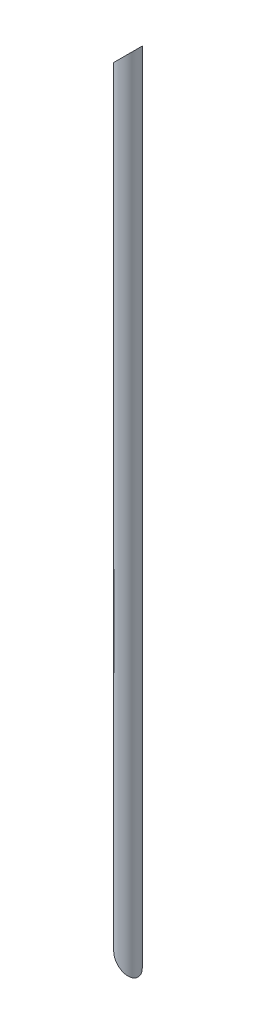
ISO-10303-21;
HEADER;
FILE_DESCRIPTION(('STEP AP214'),'2;1');
FILE_NAME('part.step','',(''),(''),'','','');
FILE_SCHEMA(('AUTOMOTIVE_DESIGN { 1 0 10303 214 1 1 1 1 }'));
ENDSEC;
DATA;
#1=APPLICATION_CONTEXT('core data for automotive mechanical design processes');
#2=APPLICATION_PROTOCOL_DEFINITION('international standard','automotive_design',2000,#1);
#3=PRODUCT_CONTEXT('',#1,'mechanical');
#4=PRODUCT('Part','Part','',(#3));
#5=PRODUCT_RELATED_PRODUCT_CATEGORY('part','',(#4));
#6=PRODUCT_DEFINITION_FORMATION('','',#4);
#7=PRODUCT_DEFINITION_CONTEXT('part definition',#1,'design');
#8=PRODUCT_DEFINITION('design','',#6,#7);
#9=PRODUCT_DEFINITION_SHAPE('','',#8);
#10=(LENGTH_UNIT() NAMED_UNIT(*) SI_UNIT(.MILLI.,.METRE.));
#11=(NAMED_UNIT(*) PLANE_ANGLE_UNIT() SI_UNIT($,.RADIAN.));
#12=(NAMED_UNIT(*) SI_UNIT($,.STERADIAN.) SOLID_ANGLE_UNIT());
#13=UNCERTAINTY_MEASURE_WITH_UNIT(LENGTH_MEASURE(1.E-05),#10,'distance_accuracy_value','');
#14=(GEOMETRIC_REPRESENTATION_CONTEXT(3) GLOBAL_UNCERTAINTY_ASSIGNED_CONTEXT((#13)) GLOBAL_UNIT_ASSIGNED_CONTEXT((#10,
#11,#12)) REPRESENTATION_CONTEXT('',''));
#15=CARTESIAN_POINT('',(0.,0.,0.));
#16=DIRECTION('',(0.,0.,1.));
#17=DIRECTION('',(1.,0.,0.));
#18=AXIS2_PLACEMENT_3D('',#15,#16,#17);
#19=CARTESIAN_POINT('',(0.,0.,0.));
#20=DIRECTION('',(0.,-1.,0.));
#21=DIRECTION('',(1.,0.,0.));
#22=AXIS2_PLACEMENT_3D('',#19,#20,#21);
#23=CYLINDRICAL_SURFACE('',#22,31.7500000000002);
#24=CARTESIAN_POINT('',(-7.67406004928299E-13,2498.96,0.));
#25=DIRECTION('',(0.707106781186548,-0.707106781186547,0.));
#26=DIRECTION('',(-0.707106781186547,-0.707106781186548,0.));
#27=AXIS2_PLACEMENT_3D('',#24,#25,#26);
#28=ELLIPSE('',#27,44.901280605346,31.7500000000002);
#29=CARTESIAN_POINT('',(-31.7500000000009,2467.21,0.));
#30=VERTEX_POINT('',#29);
#31=EDGE_CURVE('E45',#30,#30,#28,.F.);
#32=ORIENTED_EDGE('',*,*,#31,.F.);
#33=EDGE_LOOP('',(#32));
#34=FACE_BOUND('',#33,.T.);
#35=CARTESIAN_POINT('',(0.,31.7499999999998,0.));
#36=DIRECTION('',(0.707106781186543,0.707106781186552,0.));
#37=DIRECTION('',(0.707106781186552,-0.707106781186543,0.));
#38=AXIS2_PLACEMENT_3D('',#35,#36,#37);
#39=ELLIPSE('',#38,44.9012806053457,31.7500000000002);
#40=CARTESIAN_POINT('',(31.7500000000002,0.,0.));
#41=VERTEX_POINT('',#40);
#42=EDGE_CURVE('E10',#41,#41,#39,.F.);
#43=ORIENTED_EDGE('',*,*,#42,.F.);
#44=EDGE_LOOP('',(#43));
#45=FACE_BOUND('',#44,.T.);
#46=ADVANCED_FACE('F37',(#34,#45),#23,.T.);
#47=CARTESIAN_POINT('',(31.7500000000002,0.,-31.7500000000003));
#48=DIRECTION('',(0.707106781186543,0.707106781186552,0.));
#49=DIRECTION('',(-0.707106781186552,0.707106781186543,0.));
#50=AXIS2_PLACEMENT_3D('',#47,#48,#49);
#51=PLANE('',#50);
#52=CARTESIAN_POINT('',(0.,31.7499999999997,0.));
#53=DIRECTION('',(0.707106781186543,0.707106781186552,0.));
#54=DIRECTION('',(0.707106781186552,-0.707106781186543,0.));
#55=AXIS2_PLACEMENT_3D('',#52,#53,#54);
#56=ELLIPSE('',#55,43.4870670429724,30.75);
#57=CARTESIAN_POINT('',(30.75,1.0000000000001,0.));
#58=VERTEX_POINT('',#57);
#59=EDGE_CURVE('E50',#58,#58,#56,.F.);
#60=ORIENTED_EDGE('',*,*,#59,.F.);
#61=EDGE_LOOP('',(#60));
#62=FACE_BOUND('',#61,.T.);
#63=ORIENTED_EDGE('',*,*,#42,.T.);
#64=EDGE_LOOP('',(#63));
#65=FACE_BOUND('',#64,.T.);
#66=ADVANCED_FACE('F66',(#62,#65),#51,.F.);
#67=CARTESIAN_POINT('',(31.7499999999994,2530.71,-31.7500000000003));
#68=DIRECTION('',(0.707106781186548,-0.707106781186547,0.));
#69=DIRECTION('',(0.707106781186547,0.707106781186548,0.));
#70=AXIS2_PLACEMENT_3D('',#67,#68,#69);
#71=PLANE('',#70);
#72=CARTESIAN_POINT('',(0.,2498.96,0.));
#73=DIRECTION('',(0.707106781186548,-0.707106781186547,0.));
#74=DIRECTION('',(-0.707106781186547,-0.707106781186548,0.));
#75=AXIS2_PLACEMENT_3D('',#72,#73,#74);
#76=ELLIPSE('',#75,43.4870670429727,30.75);
#77=CARTESIAN_POINT('',(-30.75,2468.21,0.));
#78=VERTEX_POINT('',#77);
#79=EDGE_CURVE('E40',#78,#78,#76,.F.);
#80=ORIENTED_EDGE('',*,*,#79,.F.);
#81=EDGE_LOOP('',(#80));
#82=FACE_BOUND('',#81,.T.);
#83=ORIENTED_EDGE('',*,*,#31,.T.);
#84=EDGE_LOOP('',(#83));
#85=FACE_BOUND('',#84,.T.);
#86=ADVANCED_FACE('F63',(#82,#85),#71,.F.);
#87=CARTESIAN_POINT('',(0.,2530.71,0.));
#88=DIRECTION('',(0.,-1.,0.));
#89=DIRECTION('',(0.,0.,-1.));
#90=AXIS2_PLACEMENT_3D('',#87,#88,#89);
#91=CYLINDRICAL_SURFACE('',#90,30.75);
#92=ORIENTED_EDGE('',*,*,#79,.T.);
#93=EDGE_LOOP('',(#92));
#94=FACE_BOUND('',#93,.T.);
#95=ORIENTED_EDGE('',*,*,#59,.T.);
#96=EDGE_LOOP('',(#95));
#97=FACE_BOUND('',#96,.T.);
#98=ADVANCED_FACE('F61',(#94,#97),#91,.F.);
#99=CLOSED_SHELL('',(#46,#66,#86,#98));
#100=MANIFOLD_SOLID_BREP('B2',#99);
#101=ADVANCED_BREP_SHAPE_REPRESENTATION('',(#18,#100),#14);
#102=SHAPE_DEFINITION_REPRESENTATION(#9,#101);
ENDSEC;
END-ISO-10303-21;
